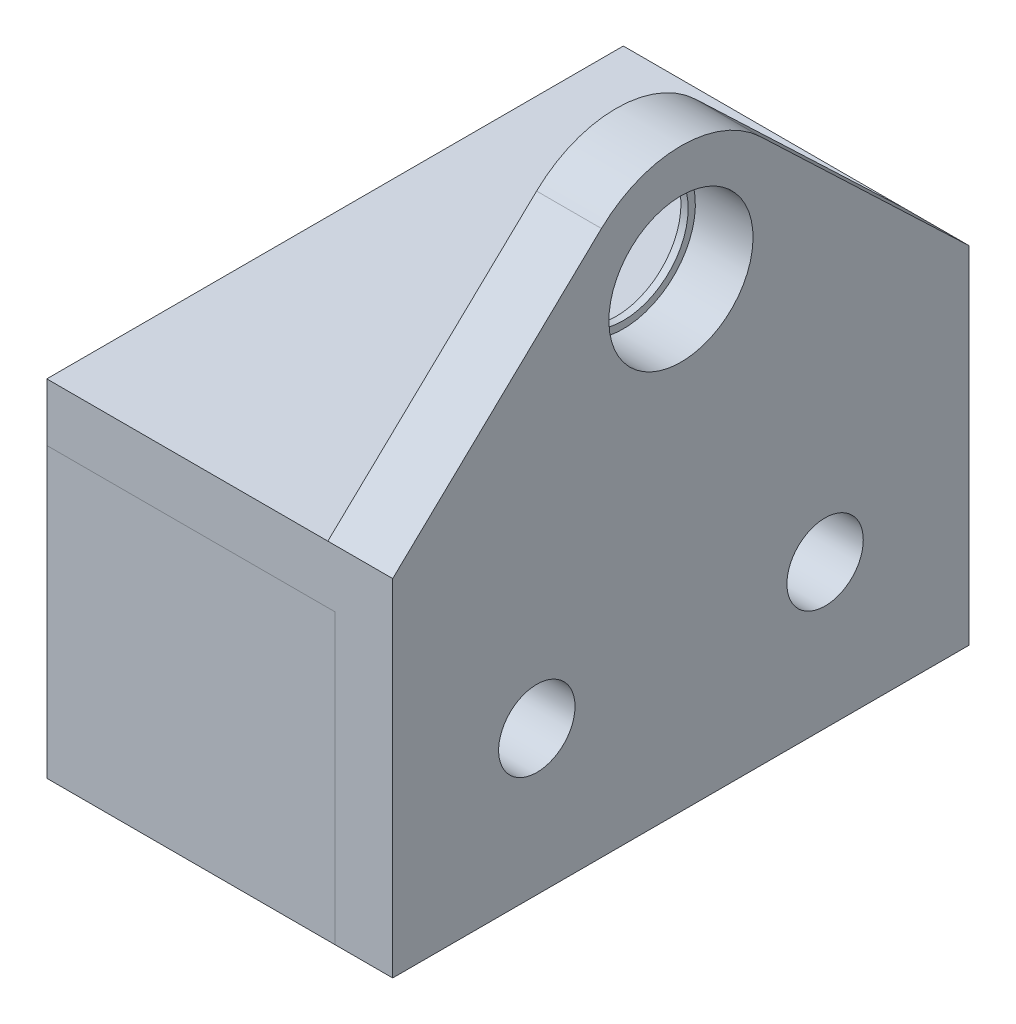
ISO-10303-21;
HEADER;
FILE_DESCRIPTION(('STEP AP214'),'2;1');
FILE_NAME('part.step','',(''),(''),'','','');
FILE_SCHEMA(('AUTOMOTIVE_DESIGN { 1 0 10303 214 1 1 1 1 }'));
ENDSEC;
DATA;
#1=APPLICATION_CONTEXT('core data for automotive mechanical design processes');
#2=APPLICATION_PROTOCOL_DEFINITION('international standard','automotive_design',2000,#1);
#3=PRODUCT_CONTEXT('',#1,'mechanical');
#4=PRODUCT('Part','Part','',(#3));
#5=PRODUCT_RELATED_PRODUCT_CATEGORY('part','',(#4));
#6=PRODUCT_DEFINITION_FORMATION('','',#4);
#7=PRODUCT_DEFINITION_CONTEXT('part definition',#1,'design');
#8=PRODUCT_DEFINITION('design','',#6,#7);
#9=PRODUCT_DEFINITION_SHAPE('','',#8);
#10=(LENGTH_UNIT() NAMED_UNIT(*) SI_UNIT(.MILLI.,.METRE.));
#11=(NAMED_UNIT(*) PLANE_ANGLE_UNIT() SI_UNIT($,.RADIAN.));
#12=(NAMED_UNIT(*) SI_UNIT($,.STERADIAN.) SOLID_ANGLE_UNIT());
#13=UNCERTAINTY_MEASURE_WITH_UNIT(LENGTH_MEASURE(1.E-05),#10,'distance_accuracy_value','');
#14=(GEOMETRIC_REPRESENTATION_CONTEXT(3) GLOBAL_UNCERTAINTY_ASSIGNED_CONTEXT((#13)) GLOBAL_UNIT_ASSIGNED_CONTEXT((#10,
#11,#12)) REPRESENTATION_CONTEXT('',''));
#15=CARTESIAN_POINT('',(0.,0.,0.));
#16=DIRECTION('',(0.,0.,1.));
#17=DIRECTION('',(1.,0.,0.));
#18=AXIS2_PLACEMENT_3D('',#15,#16,#17);
#19=CARTESIAN_POINT('',(-10.,10.,20.));
#20=DIRECTION('',(0.,1.,0.));
#21=DIRECTION('',(-1.,0.,0.));
#22=AXIS2_PLACEMENT_3D('',#19,#20,#21);
#23=PLANE('',#22);
#24=DIRECTION('',(0.,0.,-1.));
#25=VECTOR('',#24,1.);
#26=CARTESIAN_POINT('',(-3.05,10.,8.));
#27=LINE('',#26,#25);
#28=CARTESIAN_POINT('',(-3.05,10.,16.));
#29=VERTEX_POINT('',#28);
#30=CARTESIAN_POINT('',(-3.05,10.,8.));
#31=VERTEX_POINT('',#30);
#32=EDGE_CURVE('E263',#29,#31,#27,.T.);
#33=ORIENTED_EDGE('',*,*,#32,.F.);
#34=DIRECTION('',(-1.,0.,0.));
#35=VECTOR('',#34,1.);
#36=CARTESIAN_POINT('',(-3.05,10.,16.));
#37=LINE('',#36,#35);
#38=CARTESIAN_POINT('',(3.05,10.,16.));
#39=VERTEX_POINT('',#38);
#40=EDGE_CURVE('E268',#39,#29,#37,.T.);
#41=ORIENTED_EDGE('',*,*,#40,.F.);
#42=DIRECTION('',(0.,0.,1.));
#43=VECTOR('',#42,1.);
#44=CARTESIAN_POINT('',(3.05,10.,8.));
#45=LINE('',#44,#43);
#46=CARTESIAN_POINT('',(3.05,10.,8.));
#47=VERTEX_POINT('',#46);
#48=EDGE_CURVE('E277',#47,#39,#45,.T.);
#49=ORIENTED_EDGE('',*,*,#48,.F.);
#50=DIRECTION('',(1.,0.,0.));
#51=VECTOR('',#50,1.);
#52=CARTESIAN_POINT('',(-3.05,10.,8.));
#53=LINE('',#52,#51);
#54=EDGE_CURVE('E274',#31,#47,#53,.T.);
#55=ORIENTED_EDGE('',*,*,#54,.F.);
#56=EDGE_LOOP('',(#33,#41,#49,#55));
#57=FACE_BOUND('',#56,.T.);
#58=DIRECTION('',(0.,0.,1.));
#59=VECTOR('',#58,1.);
#60=CARTESIAN_POINT('',(10.,10.,20.));
#61=LINE('',#60,#59);
#62=CARTESIAN_POINT('',(10.,10.,-20.));
#63=VERTEX_POINT('',#62);
#64=CARTESIAN_POINT('',(10.,10.,20.));
#65=VERTEX_POINT('',#64);
#66=EDGE_CURVE('E289',#63,#65,#61,.T.);
#67=ORIENTED_EDGE('',*,*,#66,.T.);
#68=DIRECTION('',(1.,0.,0.));
#69=VECTOR('',#68,1.);
#70=CARTESIAN_POINT('',(-10.,10.,20.));
#71=LINE('',#70,#69);
#72=CARTESIAN_POINT('',(-10.,10.,20.));
#73=VERTEX_POINT('',#72);
#74=EDGE_CURVE('E300',#73,#65,#71,.T.);
#75=ORIENTED_EDGE('',*,*,#74,.F.);
#76=DIRECTION('',(0.,0.,1.));
#77=VECTOR('',#76,1.);
#78=CARTESIAN_POINT('',(-10.,10.,20.));
#79=LINE('',#78,#77);
#80=CARTESIAN_POINT('',(-10.,10.,-20.));
#81=VERTEX_POINT('',#80);
#82=EDGE_CURVE('E298',#81,#73,#79,.T.);
#83=ORIENTED_EDGE('',*,*,#82,.F.);
#84=DIRECTION('',(1.,0.,0.));
#85=VECTOR('',#84,1.);
#86=CARTESIAN_POINT('',(-10.,10.,-20.));
#87=LINE('',#86,#85);
#88=EDGE_CURVE('E305',#81,#63,#87,.T.);
#89=ORIENTED_EDGE('',*,*,#88,.T.);
#90=EDGE_LOOP('',(#67,#75,#83,#89));
#91=FACE_BOUND('',#90,.T.);
#92=DIRECTION('',(-1.,0.,0.));
#93=VECTOR('',#92,1.);
#94=CARTESIAN_POINT('',(-3.05,10.,-8.));
#95=LINE('',#94,#93);
#96=CARTESIAN_POINT('',(3.05,10.,-8.));
#97=VERTEX_POINT('',#96);
#98=CARTESIAN_POINT('',(-3.05,10.,-8.));
#99=VERTEX_POINT('',#98);
#100=EDGE_CURVE('E236',#97,#99,#95,.T.);
#101=ORIENTED_EDGE('',*,*,#100,.F.);
#102=DIRECTION('',(0.,0.,1.));
#103=VECTOR('',#102,1.);
#104=CARTESIAN_POINT('',(3.05,10.,-8.));
#105=LINE('',#104,#103);
#106=CARTESIAN_POINT('',(3.05,10.,-16.));
#107=VERTEX_POINT('',#106);
#108=EDGE_CURVE('E242',#107,#97,#105,.T.);
#109=ORIENTED_EDGE('',*,*,#108,.F.);
#110=DIRECTION('',(1.,0.,0.));
#111=VECTOR('',#110,1.);
#112=CARTESIAN_POINT('',(-3.05,10.,-16.));
#113=LINE('',#112,#111);
#114=CARTESIAN_POINT('',(-3.05,10.,-16.));
#115=VERTEX_POINT('',#114);
#116=EDGE_CURVE('E251',#115,#107,#113,.T.);
#117=ORIENTED_EDGE('',*,*,#116,.F.);
#118=DIRECTION('',(0.,0.,-1.));
#119=VECTOR('',#118,1.);
#120=CARTESIAN_POINT('',(-3.05,10.,-8.));
#121=LINE('',#120,#119);
#122=EDGE_CURVE('E248',#99,#115,#121,.T.);
#123=ORIENTED_EDGE('',*,*,#122,.F.);
#124=EDGE_LOOP('',(#101,#109,#117,#123));
#125=FACE_BOUND('',#124,.T.);
#126=ADVANCED_FACE('F52',(#57,#91,#125),#23,.F.);
#127=CARTESIAN_POINT('',(9.99999999999999,0.,0.));
#128=DIRECTION('',(1.,0.,0.));
#129=DIRECTION('',(0.,1.,0.));
#130=AXIS2_PLACEMENT_3D('',#127,#128,#129);
#131=PLANE('',#130);
#132=CARTESIAN_POINT('',(9.99999999999999,0.,-10.));
#133=DIRECTION('',(1.,0.,0.));
#134=DIRECTION('',(0.,1.,0.));
#135=AXIS2_PLACEMENT_3D('',#132,#133,#134);
#136=CIRCLE('',#135,2.65);
#137=CARTESIAN_POINT('',(9.99999999999999,2.65,-10.));
#138=VERTEX_POINT('',#137);
#139=EDGE_CURVE('E317',#138,#138,#136,.T.);
#140=ORIENTED_EDGE('',*,*,#139,.T.);
#141=EDGE_LOOP('',(#140));
#142=FACE_BOUND('',#141,.T.);
#143=CARTESIAN_POINT('',(9.99999999999999,0.,10.));
#144=DIRECTION('',(1.,0.,0.));
#145=DIRECTION('',(0.,1.,0.));
#146=AXIS2_PLACEMENT_3D('',#143,#144,#145);
#147=CIRCLE('',#146,2.65);
#148=CARTESIAN_POINT('',(9.99999999999999,2.65,10.));
#149=VERTEX_POINT('',#148);
#150=EDGE_CURVE('E311',#149,#149,#147,.T.);
#151=ORIENTED_EDGE('',*,*,#150,.T.);
#152=EDGE_LOOP('',(#151));
#153=FACE_BOUND('',#152,.T.);
#154=ORIENTED_EDGE('',*,*,#66,.F.);
#155=DIRECTION('',(0.,1.,0.));
#156=VECTOR('',#155,1.);
#157=CARTESIAN_POINT('',(9.99999999999999,0.,-20.));
#158=LINE('',#157,#156);
#159=CARTESIAN_POINT('',(9.99999999999999,-10.,-20.));
#160=VERTEX_POINT('',#159);
#161=EDGE_CURVE('E324',#160,#63,#158,.T.);
#162=ORIENTED_EDGE('',*,*,#161,.F.);
#163=DIRECTION('',(0.,0.,-1.));
#164=VECTOR('',#163,1.);
#165=CARTESIAN_POINT('',(9.99999999999999,-10.,0.));
#166=LINE('',#165,#164);
#167=CARTESIAN_POINT('',(9.99999999999999,-10.,20.));
#168=VERTEX_POINT('',#167);
#169=EDGE_CURVE('E330',#168,#160,#166,.T.);
#170=ORIENTED_EDGE('',*,*,#169,.F.);
#171=DIRECTION('',(0.,1.,0.));
#172=VECTOR('',#171,1.);
#173=CARTESIAN_POINT('',(9.99999999999999,0.,20.));
#174=LINE('',#173,#172);
#175=EDGE_CURVE('E320',#168,#65,#174,.T.);
#176=ORIENTED_EDGE('',*,*,#175,.T.);
#177=EDGE_LOOP('',(#154,#162,#170,#176));
#178=FACE_BOUND('',#177,.T.);
#179=ADVANCED_FACE('F411',(#142,#153,#178),#131,.F.);
#180=CARTESIAN_POINT('',(14.,0.,20.));
#181=DIRECTION('',(0.,0.,1.));
#182=DIRECTION('',(1.,0.,0.));
#183=AXIS2_PLACEMENT_3D('',#180,#181,#182);
#184=PLANE('',#183);
#185=ORIENTED_EDGE('',*,*,#175,.F.);
#186=DIRECTION('',(-1.,0.,0.));
#187=VECTOR('',#186,1.);
#188=CARTESIAN_POINT('',(14.,-10.,20.));
#189=LINE('',#188,#187);
#190=CARTESIAN_POINT('',(14.,-10.,20.));
#191=VERTEX_POINT('',#190);
#192=EDGE_CURVE('E343',#191,#168,#189,.T.);
#193=ORIENTED_EDGE('',*,*,#192,.F.);
#194=DIRECTION('',(0.,1.,0.));
#195=VECTOR('',#194,1.);
#196=CARTESIAN_POINT('',(14.,0.,20.));
#197=LINE('',#196,#195);
#198=CARTESIAN_POINT('',(14.,14.,20.));
#199=VERTEX_POINT('',#198);
#200=EDGE_CURVE('E321',#191,#199,#197,.T.);
#201=ORIENTED_EDGE('',*,*,#200,.T.);
#202=DIRECTION('',(-1.,0.,0.));
#203=VECTOR('',#202,1.);
#204=CARTESIAN_POINT('',(14.,14.,20.));
#205=LINE('',#204,#203);
#206=CARTESIAN_POINT('',(9.5,14.,20.));
#207=VERTEX_POINT('',#206);
#208=EDGE_CURVE('E334',#199,#207,#205,.T.);
#209=ORIENTED_EDGE('',*,*,#208,.T.);
#210=CARTESIAN_POINT('',(-10.,14.,20.));
#211=VERTEX_POINT('',#210);
#212=EDGE_CURVE('E328',#207,#211,#205,.T.);
#213=ORIENTED_EDGE('',*,*,#212,.T.);
#214=DIRECTION('',(0.,1.,0.));
#215=VECTOR('',#214,1.);
#216=CARTESIAN_POINT('',(-10.,14.,20.));
#217=LINE('',#216,#215);
#218=EDGE_CURVE('E290',#73,#211,#217,.T.);
#219=ORIENTED_EDGE('',*,*,#218,.F.);
#220=ORIENTED_EDGE('',*,*,#74,.T.);
#221=EDGE_LOOP('',(#185,#193,#201,#209,#213,#219,#220));
#222=FACE_BOUND('',#221,.T.);
#223=ADVANCED_FACE('F417',(#222),#184,.T.);
#224=CARTESIAN_POINT('',(14.,-10.,0.));
#225=DIRECTION('',(0.,1.,0.));
#226=DIRECTION('',(-1.,0.,0.));
#227=AXIS2_PLACEMENT_3D('',#224,#225,#226);
#228=PLANE('',#227);
#229=ORIENTED_EDGE('',*,*,#169,.T.);
#230=DIRECTION('',(-1.,0.,0.));
#231=VECTOR('',#230,1.);
#232=CARTESIAN_POINT('',(14.,-10.,-20.));
#233=LINE('',#232,#231);
#234=CARTESIAN_POINT('',(14.,-10.,-20.));
#235=VERTEX_POINT('',#234);
#236=EDGE_CURVE('E340',#235,#160,#233,.T.);
#237=ORIENTED_EDGE('',*,*,#236,.F.);
#238=DIRECTION('',(0.,0.,-1.));
#239=VECTOR('',#238,1.);
#240=CARTESIAN_POINT('',(14.,-10.,0.));
#241=LINE('',#240,#239);
#242=EDGE_CURVE('E323',#191,#235,#241,.T.);
#243=ORIENTED_EDGE('',*,*,#242,.F.);
#244=ORIENTED_EDGE('',*,*,#192,.T.);
#245=EDGE_LOOP('',(#229,#237,#243,#244));
#246=FACE_BOUND('',#245,.T.);
#247=ADVANCED_FACE('F444',(#246),#228,.F.);
#248=CARTESIAN_POINT('',(14.,0.,-20.));
#249=DIRECTION('',(0.,0.,1.));
#250=DIRECTION('',(1.,0.,0.));
#251=AXIS2_PLACEMENT_3D('',#248,#249,#250);
#252=PLANE('',#251);
#253=ORIENTED_EDGE('',*,*,#161,.T.);
#254=ORIENTED_EDGE('',*,*,#88,.F.);
#255=DIRECTION('',(0.,-1.,0.));
#256=VECTOR('',#255,1.);
#257=CARTESIAN_POINT('',(-10.,14.,-20.));
#258=LINE('',#257,#256);
#259=CARTESIAN_POINT('',(-10.,14.,-20.));
#260=VERTEX_POINT('',#259);
#261=EDGE_CURVE('E296',#260,#81,#258,.T.);
#262=ORIENTED_EDGE('',*,*,#261,.F.);
#263=DIRECTION('',(-1.,0.,0.));
#264=VECTOR('',#263,1.);
#265=CARTESIAN_POINT('',(14.,14.,-20.));
#266=LINE('',#265,#264);
#267=CARTESIAN_POINT('',(9.5,14.,-20.));
#268=VERTEX_POINT('',#267);
#269=EDGE_CURVE('E336',#268,#260,#266,.T.);
#270=ORIENTED_EDGE('',*,*,#269,.F.);
#271=CARTESIAN_POINT('',(14.,14.,-20.));
#272=VERTEX_POINT('',#271);
#273=EDGE_CURVE('E337',#272,#268,#266,.T.);
#274=ORIENTED_EDGE('',*,*,#273,.F.);
#275=DIRECTION('',(0.,1.,0.));
#276=VECTOR('',#275,1.);
#277=CARTESIAN_POINT('',(14.,0.,-20.));
#278=LINE('',#277,#276);
#279=EDGE_CURVE('E326',#235,#272,#278,.T.);
#280=ORIENTED_EDGE('',*,*,#279,.F.);
#281=ORIENTED_EDGE('',*,*,#236,.T.);
#282=EDGE_LOOP('',(#253,#254,#262,#270,#274,#280,#281));
#283=FACE_BOUND('',#282,.T.);
#284=ADVANCED_FACE('F441',(#283),#252,.F.);
#285=CARTESIAN_POINT('',(14.,14.,0.));
#286=DIRECTION('',(0.,1.,0.));
#287=DIRECTION('',(-1.,0.,0.));
#288=AXIS2_PLACEMENT_3D('',#285,#286,#287);
#289=PLANE('',#288);
#290=DIRECTION('',(0.,0.,1.));
#291=VECTOR('',#290,1.);
#292=CARTESIAN_POINT('',(9.5,14.,0.));
#293=LINE('',#292,#291);
#294=EDGE_CURVE('E67',#268,#207,#293,.T.);
#295=ORIENTED_EDGE('',*,*,#294,.F.);
#296=ORIENTED_EDGE('',*,*,#269,.T.);
#297=DIRECTION('',(0.,0.,-1.));
#298=VECTOR('',#297,1.);
#299=CARTESIAN_POINT('',(-10.,14.,20.));
#300=LINE('',#299,#298);
#301=EDGE_CURVE('E293',#211,#260,#300,.T.);
#302=ORIENTED_EDGE('',*,*,#301,.F.);
#303=ORIENTED_EDGE('',*,*,#212,.F.);
#304=EDGE_LOOP('',(#295,#296,#302,#303));
#305=FACE_BOUND('',#304,.T.);
#306=ADVANCED_FACE('F436',(#305),#289,.T.);
#307=CARTESIAN_POINT('',(14.,0.,0.));
#308=DIRECTION('',(1.,0.,0.));
#309=DIRECTION('',(0.,1.,0.));
#310=AXIS2_PLACEMENT_3D('',#307,#308,#309);
#311=PLANE('',#310);
#312=CARTESIAN_POINT('',(14.,0.,10.));
#313=DIRECTION('',(1.,0.,0.));
#314=DIRECTION('',(0.,0.,-1.));
#315=AXIS2_PLACEMENT_3D('',#312,#313,#314);
#316=CIRCLE('',#315,2.65);
#317=CARTESIAN_POINT('',(14.,0.,7.35));
#318=VERTEX_POINT('',#317);
#319=EDGE_CURVE('E308',#318,#318,#316,.T.);
#320=ORIENTED_EDGE('',*,*,#319,.F.);
#321=EDGE_LOOP('',(#320));
#322=FACE_BOUND('',#321,.T.);
#323=CARTESIAN_POINT('',(14.,0.,-10.));
#324=DIRECTION('',(1.,0.,0.));
#325=DIRECTION('',(0.,0.,-1.));
#326=AXIS2_PLACEMENT_3D('',#323,#324,#325);
#327=CIRCLE('',#326,2.65);
#328=CARTESIAN_POINT('',(14.,0.,-12.65));
#329=VERTEX_POINT('',#328);
#330=EDGE_CURVE('E314',#329,#329,#327,.T.);
#331=ORIENTED_EDGE('',*,*,#330,.F.);
#332=EDGE_LOOP('',(#331));
#333=FACE_BOUND('',#332,.T.);
#334=ORIENTED_EDGE('',*,*,#200,.F.);
#335=ORIENTED_EDGE('',*,*,#242,.T.);
#336=ORIENTED_EDGE('',*,*,#279,.T.);
#337=DIRECTION('',(0.,-0.689655172413793,-0.724137931034483));
#338=VECTOR('',#337,1.);
#339=CARTESIAN_POINT('',(14.,17.3293697978597,-16.5041617122473));
#340=LINE('',#339,#338);
#341=CARTESIAN_POINT('',(14.,27.7931034482759,-5.51724137931034));
#342=VERTEX_POINT('',#341);
#343=EDGE_CURVE('E222',#342,#272,#340,.T.);
#344=ORIENTED_EDGE('',*,*,#343,.F.);
#345=CARTESIAN_POINT('',(14.,22.,0.));
#346=DIRECTION('',(1.,0.,0.));
#347=DIRECTION('',(0.,1.,0.));
#348=AXIS2_PLACEMENT_3D('',#345,#346,#347);
#349=CIRCLE('',#348,8.);
#350=CARTESIAN_POINT('',(14.,27.7931034482759,5.51724137931034));
#351=VERTEX_POINT('',#350);
#352=EDGE_CURVE('E230',#351,#342,#349,.F.);
#353=ORIENTED_EDGE('',*,*,#352,.F.);
#354=DIRECTION('',(0.,0.689655172413793,-0.724137931034483));
#355=VECTOR('',#354,1.);
#356=CARTESIAN_POINT('',(14.,17.3293697978597,16.5041617122473));
#357=LINE('',#356,#355);
#358=EDGE_CURVE('E210',#199,#351,#357,.T.);
#359=ORIENTED_EDGE('',*,*,#358,.F.);
#360=EDGE_LOOP('',(#334,#335,#336,#344,#353,#359));
#361=FACE_BOUND('',#360,.T.);
#362=CARTESIAN_POINT('',(14.,22.,0.));
#363=DIRECTION('',(1.,0.,0.));
#364=DIRECTION('',(0.,1.,0.));
#365=AXIS2_PLACEMENT_3D('',#362,#363,#364);
#366=CIRCLE('',#365,5.);
#367=CARTESIAN_POINT('',(14.,27.,0.));
#368=VERTEX_POINT('',#367);
#369=EDGE_CURVE('E219',#368,#368,#366,.T.);
#370=ORIENTED_EDGE('',*,*,#369,.F.);
#371=EDGE_LOOP('',(#370));
#372=FACE_BOUND('',#371,.T.);
#373=ADVANCED_FACE('F433',(#322,#333,#361,#372),#311,.T.);
#374=CARTESIAN_POINT('',(14.,0.,-10.));
#375=DIRECTION('',(1.,0.,0.));
#376=DIRECTION('',(0.,0.,-1.));
#377=AXIS2_PLACEMENT_3D('',#374,#375,#376);
#378=CYLINDRICAL_SURFACE('',#377,2.65);
#379=ORIENTED_EDGE('',*,*,#139,.F.);
#380=EDGE_LOOP('',(#379));
#381=FACE_BOUND('',#380,.T.);
#382=ORIENTED_EDGE('',*,*,#330,.T.);
#383=EDGE_LOOP('',(#382));
#384=FACE_BOUND('',#383,.T.);
#385=ADVANCED_FACE('F429',(#381,#384),#378,.F.);
#386=CARTESIAN_POINT('',(14.,0.,10.));
#387=DIRECTION('',(1.,0.,0.));
#388=DIRECTION('',(0.,0.,-1.));
#389=AXIS2_PLACEMENT_3D('',#386,#387,#388);
#390=CYLINDRICAL_SURFACE('',#389,2.65);
#391=ORIENTED_EDGE('',*,*,#150,.F.);
#392=EDGE_LOOP('',(#391));
#393=FACE_BOUND('',#392,.T.);
#394=ORIENTED_EDGE('',*,*,#319,.T.);
#395=EDGE_LOOP('',(#394));
#396=FACE_BOUND('',#395,.T.);
#397=ADVANCED_FACE('F426',(#393,#396),#390,.F.);
#398=CARTESIAN_POINT('',(-10.,0.,0.));
#399=DIRECTION('',(1.,0.,0.));
#400=DIRECTION('',(0.,0.,-1.));
#401=AXIS2_PLACEMENT_3D('',#398,#399,#400);
#402=PLANE('',#401);
#403=ORIENTED_EDGE('',*,*,#218,.T.);
#404=ORIENTED_EDGE('',*,*,#301,.T.);
#405=ORIENTED_EDGE('',*,*,#261,.T.);
#406=ORIENTED_EDGE('',*,*,#82,.T.);
#407=EDGE_LOOP('',(#403,#404,#405,#406));
#408=FACE_BOUND('',#407,.T.);
#409=ADVANCED_FACE('F424',(#408),#402,.F.);
#410=CARTESIAN_POINT('',(-3.05,7.,8.));
#411=DIRECTION('',(1.,0.,0.));
#412=DIRECTION('',(0.,1.,0.));
#413=AXIS2_PLACEMENT_3D('',#410,#411,#412);
#414=PLANE('',#413);
#415=DIRECTION('',(0.,1.,0.));
#416=VECTOR('',#415,1.);
#417=CARTESIAN_POINT('',(-3.05,7.,8.));
#418=LINE('',#417,#416);
#419=CARTESIAN_POINT('',(-3.05,8.,8.));
#420=VERTEX_POINT('',#419);
#421=EDGE_CURVE('E287',#420,#31,#418,.T.);
#422=ORIENTED_EDGE('',*,*,#421,.F.);
#423=DIRECTION('',(0.,0.,1.));
#424=VECTOR('',#423,1.);
#425=CARTESIAN_POINT('',(-3.05,8.,8.));
#426=LINE('',#425,#424);
#427=CARTESIAN_POINT('',(-3.05,8.,16.));
#428=VERTEX_POINT('',#427);
#429=EDGE_CURVE('E355',#420,#428,#426,.T.);
#430=ORIENTED_EDGE('',*,*,#429,.T.);
#431=DIRECTION('',(0.,1.,0.));
#432=VECTOR('',#431,1.);
#433=CARTESIAN_POINT('',(-3.05,7.,16.));
#434=LINE('',#433,#432);
#435=EDGE_CURVE('E271',#428,#29,#434,.T.);
#436=ORIENTED_EDGE('',*,*,#435,.T.);
#437=ORIENTED_EDGE('',*,*,#32,.T.);
#438=EDGE_LOOP('',(#422,#430,#436,#437));
#439=FACE_BOUND('',#438,.T.);
#440=ADVANCED_FACE('F476',(#439),#414,.F.);
#441=CARTESIAN_POINT('',(-3.05,7.,8.));
#442=DIRECTION('',(0.,0.,1.));
#443=DIRECTION('',(1.,0.,0.));
#444=AXIS2_PLACEMENT_3D('',#441,#442,#443);
#445=PLANE('',#444);
#446=DIRECTION('',(1.,0.,0.));
#447=VECTOR('',#446,1.);
#448=CARTESIAN_POINT('',(-3.05,7.,8.));
#449=LINE('',#448,#447);
#450=CARTESIAN_POINT('',(-2.05000000000001,7.,8.));
#451=VERTEX_POINT('',#450);
#452=CARTESIAN_POINT('',(2.05000000000001,7.,8.));
#453=VERTEX_POINT('',#452);
#454=EDGE_CURVE('E264',#451,#453,#449,.T.);
#455=ORIENTED_EDGE('',*,*,#454,.F.);
#456=DIRECTION('',(0.707106781186545,-0.70710678118655,0.));
#457=VECTOR('',#456,1.);
#458=CARTESIAN_POINT('',(-2.05000000000001,7.,8.));
#459=LINE('',#458,#457);
#460=EDGE_CURVE('E353',#451,#420,#459,.F.);
#461=ORIENTED_EDGE('',*,*,#460,.T.);
#462=ORIENTED_EDGE('',*,*,#421,.T.);
#463=ORIENTED_EDGE('',*,*,#54,.T.);
#464=DIRECTION('',(0.,1.,0.));
#465=VECTOR('',#464,1.);
#466=CARTESIAN_POINT('',(3.05,7.,8.));
#467=LINE('',#466,#465);
#468=CARTESIAN_POINT('',(3.05,8.,8.));
#469=VERTEX_POINT('',#468);
#470=EDGE_CURVE('E285',#469,#47,#467,.T.);
#471=ORIENTED_EDGE('',*,*,#470,.F.);
#472=DIRECTION('',(0.707106781186545,0.70710678118655,0.));
#473=VECTOR('',#472,1.);
#474=CARTESIAN_POINT('',(2.05000000000001,7.,8.));
#475=LINE('',#474,#473);
#476=EDGE_CURVE('E351',#469,#453,#475,.F.);
#477=ORIENTED_EDGE('',*,*,#476,.T.);
#478=EDGE_LOOP('',(#455,#461,#462,#463,#471,#477));
#479=FACE_BOUND('',#478,.T.);
#480=ADVANCED_FACE('F466',(#479),#445,.F.);
#481=CARTESIAN_POINT('',(3.05,7.,8.));
#482=DIRECTION('',(-1.,0.,0.));
#483=DIRECTION('',(0.,-1.,0.));
#484=AXIS2_PLACEMENT_3D('',#481,#482,#483);
#485=PLANE('',#484);
#486=DIRECTION('',(0.,1.,0.));
#487=VECTOR('',#486,1.);
#488=CARTESIAN_POINT('',(3.05,7.,16.));
#489=LINE('',#488,#487);
#490=CARTESIAN_POINT('',(3.05,8.,16.));
#491=VERTEX_POINT('',#490);
#492=EDGE_CURVE('E283',#491,#39,#489,.T.);
#493=ORIENTED_EDGE('',*,*,#492,.F.);
#494=DIRECTION('',(0.,0.,-1.));
#495=VECTOR('',#494,1.);
#496=CARTESIAN_POINT('',(3.05,8.,8.));
#497=LINE('',#496,#495);
#498=EDGE_CURVE('E361',#491,#469,#497,.T.);
#499=ORIENTED_EDGE('',*,*,#498,.T.);
#500=ORIENTED_EDGE('',*,*,#470,.T.);
#501=ORIENTED_EDGE('',*,*,#48,.T.);
#502=EDGE_LOOP('',(#493,#499,#500,#501));
#503=FACE_BOUND('',#502,.T.);
#504=ADVANCED_FACE('F484',(#503),#485,.F.);
#505=CARTESIAN_POINT('',(-3.05,7.,16.));
#506=DIRECTION('',(0.,0.,-1.));
#507=DIRECTION('',(-1.,0.,0.));
#508=AXIS2_PLACEMENT_3D('',#505,#506,#507);
#509=PLANE('',#508);
#510=ORIENTED_EDGE('',*,*,#435,.F.);
#511=DIRECTION('',(-0.707106781186545,0.70710678118655,0.));
#512=VECTOR('',#511,1.);
#513=CARTESIAN_POINT('',(-2.05000000000001,7.,16.));
#514=LINE('',#513,#512);
#515=CARTESIAN_POINT('',(-2.05000000000001,7.,16.));
#516=VERTEX_POINT('',#515);
#517=EDGE_CURVE('E359',#428,#516,#514,.F.);
#518=ORIENTED_EDGE('',*,*,#517,.T.);
#519=DIRECTION('',(-1.,0.,0.));
#520=VECTOR('',#519,1.);
#521=CARTESIAN_POINT('',(-3.05,7.,16.));
#522=LINE('',#521,#520);
#523=CARTESIAN_POINT('',(2.05000000000001,7.,16.));
#524=VERTEX_POINT('',#523);
#525=EDGE_CURVE('E267',#524,#516,#522,.T.);
#526=ORIENTED_EDGE('',*,*,#525,.F.);
#527=DIRECTION('',(-0.707106781186545,-0.70710678118655,0.));
#528=VECTOR('',#527,1.);
#529=CARTESIAN_POINT('',(2.05000000000001,7.,16.));
#530=LINE('',#529,#528);
#531=EDGE_CURVE('E357',#524,#491,#530,.F.);
#532=ORIENTED_EDGE('',*,*,#531,.T.);
#533=ORIENTED_EDGE('',*,*,#492,.T.);
#534=ORIENTED_EDGE('',*,*,#40,.T.);
#535=EDGE_LOOP('',(#510,#518,#526,#532,#533,#534));
#536=FACE_BOUND('',#535,.T.);
#537=ADVANCED_FACE('F481',(#536),#509,.F.);
#538=CARTESIAN_POINT('',(0.,7.,0.));
#539=DIRECTION('',(0.,1.,0.));
#540=DIRECTION('',(0.,0.,1.));
#541=AXIS2_PLACEMENT_3D('',#538,#539,#540);
#542=PLANE('',#541);
#543=ORIENTED_EDGE('',*,*,#525,.T.);
#544=DIRECTION('',(0.,0.,-1.));
#545=VECTOR('',#544,1.);
#546=CARTESIAN_POINT('',(-2.05000000000001,7.,0.));
#547=LINE('',#546,#545);
#548=EDGE_CURVE('E348',#516,#451,#547,.T.);
#549=ORIENTED_EDGE('',*,*,#548,.T.);
#550=ORIENTED_EDGE('',*,*,#454,.T.);
#551=DIRECTION('',(0.,0.,1.));
#552=VECTOR('',#551,1.);
#553=CARTESIAN_POINT('',(2.05000000000001,7.,0.));
#554=LINE('',#553,#552);
#555=EDGE_CURVE('E345',#453,#524,#554,.T.);
#556=ORIENTED_EDGE('',*,*,#555,.T.);
#557=EDGE_LOOP('',(#543,#549,#550,#556));
#558=FACE_BOUND('',#557,.T.);
#559=ADVANCED_FACE('F468',(#558),#542,.F.);
#560=CARTESIAN_POINT('',(-3.05,7.,-8.));
#561=DIRECTION('',(0.,0.,-1.));
#562=DIRECTION('',(-1.,0.,0.));
#563=AXIS2_PLACEMENT_3D('',#560,#561,#562);
#564=PLANE('',#563);
#565=DIRECTION('',(-1.,0.,0.));
#566=VECTOR('',#565,1.);
#567=CARTESIAN_POINT('',(-3.05,7.,-8.));
#568=LINE('',#567,#566);
#569=CARTESIAN_POINT('',(2.05000000000001,7.,-8.));
#570=VERTEX_POINT('',#569);
#571=CARTESIAN_POINT('',(-2.05000000000001,7.,-8.));
#572=VERTEX_POINT('',#571);
#573=EDGE_CURVE('E238',#570,#572,#568,.T.);
#574=ORIENTED_EDGE('',*,*,#573,.F.);
#575=DIRECTION('',(-0.707106781186545,-0.70710678118655,0.));
#576=VECTOR('',#575,1.);
#577=CARTESIAN_POINT('',(2.05000000000001,7.,-8.));
#578=LINE('',#577,#576);
#579=CARTESIAN_POINT('',(3.05,8.,-8.));
#580=VERTEX_POINT('',#579);
#581=EDGE_CURVE('E371',#570,#580,#578,.F.);
#582=ORIENTED_EDGE('',*,*,#581,.T.);
#583=DIRECTION('',(0.,1.,0.));
#584=VECTOR('',#583,1.);
#585=CARTESIAN_POINT('',(3.05,7.,-8.));
#586=LINE('',#585,#584);
#587=EDGE_CURVE('E245',#580,#97,#586,.T.);
#588=ORIENTED_EDGE('',*,*,#587,.T.);
#589=ORIENTED_EDGE('',*,*,#100,.T.);
#590=DIRECTION('',(0.,1.,0.));
#591=VECTOR('',#590,1.);
#592=CARTESIAN_POINT('',(-3.05,7.,-8.));
#593=LINE('',#592,#591);
#594=CARTESIAN_POINT('',(-3.05,8.,-8.));
#595=VERTEX_POINT('',#594);
#596=EDGE_CURVE('E261',#595,#99,#593,.T.);
#597=ORIENTED_EDGE('',*,*,#596,.F.);
#598=DIRECTION('',(-0.707106781186545,0.70710678118655,0.));
#599=VECTOR('',#598,1.);
#600=CARTESIAN_POINT('',(-2.05000000000001,7.,-8.));
#601=LINE('',#600,#599);
#602=EDGE_CURVE('E369',#595,#572,#601,.F.);
#603=ORIENTED_EDGE('',*,*,#602,.T.);
#604=EDGE_LOOP('',(#574,#582,#588,#589,#597,#603));
#605=FACE_BOUND('',#604,.T.);
#606=ADVANCED_FACE('F388',(#605),#564,.F.);
#607=CARTESIAN_POINT('',(-3.05,7.,-8.));
#608=DIRECTION('',(1.,0.,0.));
#609=DIRECTION('',(0.,1.,0.));
#610=AXIS2_PLACEMENT_3D('',#607,#608,#609);
#611=PLANE('',#610);
#612=DIRECTION('',(0.,1.,0.));
#613=VECTOR('',#612,1.);
#614=CARTESIAN_POINT('',(-3.05,7.,-16.));
#615=LINE('',#614,#613);
#616=CARTESIAN_POINT('',(-3.05,8.,-16.));
#617=VERTEX_POINT('',#616);
#618=EDGE_CURVE('E259',#617,#115,#615,.T.);
#619=ORIENTED_EDGE('',*,*,#618,.F.);
#620=DIRECTION('',(0.,0.,1.));
#621=VECTOR('',#620,1.);
#622=CARTESIAN_POINT('',(-3.05,8.,-8.));
#623=LINE('',#622,#621);
#624=EDGE_CURVE('E13',#617,#595,#623,.T.);
#625=ORIENTED_EDGE('',*,*,#624,.T.);
#626=ORIENTED_EDGE('',*,*,#596,.T.);
#627=ORIENTED_EDGE('',*,*,#122,.T.);
#628=EDGE_LOOP('',(#619,#625,#626,#627));
#629=FACE_BOUND('',#628,.T.);
#630=ADVANCED_FACE('F398',(#629),#611,.F.);
#631=CARTESIAN_POINT('',(-3.05,7.,-16.));
#632=DIRECTION('',(0.,0.,1.));
#633=DIRECTION('',(1.,0.,0.));
#634=AXIS2_PLACEMENT_3D('',#631,#632,#633);
#635=PLANE('',#634);
#636=DIRECTION('',(0.,1.,0.));
#637=VECTOR('',#636,1.);
#638=CARTESIAN_POINT('',(3.05,7.,-16.));
#639=LINE('',#638,#637);
#640=CARTESIAN_POINT('',(3.05,8.,-16.));
#641=VERTEX_POINT('',#640);
#642=EDGE_CURVE('E257',#641,#107,#639,.T.);
#643=ORIENTED_EDGE('',*,*,#642,.F.);
#644=DIRECTION('',(0.707106781186545,0.70710678118655,0.));
#645=VECTOR('',#644,1.);
#646=CARTESIAN_POINT('',(2.05000000000001,7.,-16.));
#647=LINE('',#646,#645);
#648=CARTESIAN_POINT('',(2.05000000000001,7.,-16.));
#649=VERTEX_POINT('',#648);
#650=EDGE_CURVE('E60',#641,#649,#647,.F.);
#651=ORIENTED_EDGE('',*,*,#650,.T.);
#652=DIRECTION('',(1.,0.,0.));
#653=VECTOR('',#652,1.);
#654=CARTESIAN_POINT('',(-3.05,7.,-16.));
#655=LINE('',#654,#653);
#656=CARTESIAN_POINT('',(-2.05000000000001,7.,-16.));
#657=VERTEX_POINT('',#656);
#658=EDGE_CURVE('E241',#657,#649,#655,.T.);
#659=ORIENTED_EDGE('',*,*,#658,.F.);
#660=DIRECTION('',(0.707106781186545,-0.70710678118655,0.));
#661=VECTOR('',#660,1.);
#662=CARTESIAN_POINT('',(-2.05000000000001,7.,-16.));
#663=LINE('',#662,#661);
#664=EDGE_CURVE('E75',#657,#617,#663,.F.);
#665=ORIENTED_EDGE('',*,*,#664,.T.);
#666=ORIENTED_EDGE('',*,*,#618,.T.);
#667=ORIENTED_EDGE('',*,*,#116,.T.);
#668=EDGE_LOOP('',(#643,#651,#659,#665,#666,#667));
#669=FACE_BOUND('',#668,.T.);
#670=ADVANCED_FACE('F377',(#669),#635,.F.);
#671=CARTESIAN_POINT('',(3.05,7.,-8.));
#672=DIRECTION('',(-1.,0.,0.));
#673=DIRECTION('',(0.,-1.,0.));
#674=AXIS2_PLACEMENT_3D('',#671,#672,#673);
#675=PLANE('',#674);
#676=ORIENTED_EDGE('',*,*,#587,.F.);
#677=DIRECTION('',(0.,0.,-1.));
#678=VECTOR('',#677,1.);
#679=CARTESIAN_POINT('',(3.05,8.,-8.));
#680=LINE('',#679,#678);
#681=EDGE_CURVE('E373',#580,#641,#680,.T.);
#682=ORIENTED_EDGE('',*,*,#681,.T.);
#683=ORIENTED_EDGE('',*,*,#642,.T.);
#684=ORIENTED_EDGE('',*,*,#108,.T.);
#685=EDGE_LOOP('',(#676,#682,#683,#684));
#686=FACE_BOUND('',#685,.T.);
#687=ADVANCED_FACE('F391',(#686),#675,.F.);
#688=CARTESIAN_POINT('',(0.,7.,0.));
#689=DIRECTION('',(0.,1.,0.));
#690=DIRECTION('',(0.,0.,1.));
#691=AXIS2_PLACEMENT_3D('',#688,#689,#690);
#692=PLANE('',#691);
#693=ORIENTED_EDGE('',*,*,#658,.T.);
#694=DIRECTION('',(0.,0.,1.));
#695=VECTOR('',#694,1.);
#696=CARTESIAN_POINT('',(2.05000000000001,7.,0.));
#697=LINE('',#696,#695);
#698=EDGE_CURVE('E366',#649,#570,#697,.T.);
#699=ORIENTED_EDGE('',*,*,#698,.T.);
#700=ORIENTED_EDGE('',*,*,#573,.T.);
#701=DIRECTION('',(0.,0.,-1.));
#702=VECTOR('',#701,1.);
#703=CARTESIAN_POINT('',(-2.05000000000001,7.,0.));
#704=LINE('',#703,#702);
#705=EDGE_CURVE('E363',#572,#657,#704,.T.);
#706=ORIENTED_EDGE('',*,*,#705,.T.);
#707=EDGE_LOOP('',(#693,#699,#700,#706));
#708=FACE_BOUND('',#707,.T.);
#709=ADVANCED_FACE('F382',(#708),#692,.F.);
#710=CARTESIAN_POINT('',(-2.05000000000001,7.,0.));
#711=DIRECTION('',(0.70710678118655,0.707106781186545,0.));
#712=DIRECTION('',(0.,0.,-1.));
#713=AXIS2_PLACEMENT_3D('',#710,#711,#712);
#714=PLANE('',#713);
#715=ORIENTED_EDGE('',*,*,#517,.F.);
#716=ORIENTED_EDGE('',*,*,#429,.F.);
#717=ORIENTED_EDGE('',*,*,#460,.F.);
#718=ORIENTED_EDGE('',*,*,#548,.F.);
#719=EDGE_LOOP('',(#715,#716,#717,#718));
#720=FACE_BOUND('',#719,.T.);
#721=ADVANCED_FACE('F452',(#720),#714,.F.);
#722=CARTESIAN_POINT('',(2.05000000000001,7.,0.));
#723=DIRECTION('',(-0.70710678118655,0.707106781186545,0.));
#724=DIRECTION('',(0.,0.,1.));
#725=AXIS2_PLACEMENT_3D('',#722,#723,#724);
#726=PLANE('',#725);
#727=ORIENTED_EDGE('',*,*,#476,.F.);
#728=ORIENTED_EDGE('',*,*,#498,.F.);
#729=ORIENTED_EDGE('',*,*,#531,.F.);
#730=ORIENTED_EDGE('',*,*,#555,.F.);
#731=EDGE_LOOP('',(#727,#728,#729,#730));
#732=FACE_BOUND('',#731,.T.);
#733=ADVANCED_FACE('F409',(#732),#726,.F.);
#734=CARTESIAN_POINT('',(2.05000000000001,7.,0.));
#735=DIRECTION('',(-0.70710678118655,0.707106781186545,0.));
#736=DIRECTION('',(0.,0.,1.));
#737=AXIS2_PLACEMENT_3D('',#734,#735,#736);
#738=PLANE('',#737);
#739=ORIENTED_EDGE('',*,*,#650,.F.);
#740=ORIENTED_EDGE('',*,*,#681,.F.);
#741=ORIENTED_EDGE('',*,*,#581,.F.);
#742=ORIENTED_EDGE('',*,*,#698,.F.);
#743=EDGE_LOOP('',(#739,#740,#741,#742));
#744=FACE_BOUND('',#743,.T.);
#745=ADVANCED_FACE('F385',(#744),#738,.F.);
#746=CARTESIAN_POINT('',(-2.05000000000001,7.,0.));
#747=DIRECTION('',(0.70710678118655,0.707106781186545,0.));
#748=DIRECTION('',(0.,0.,-1.));
#749=AXIS2_PLACEMENT_3D('',#746,#747,#748);
#750=PLANE('',#749);
#751=ORIENTED_EDGE('',*,*,#602,.F.);
#752=ORIENTED_EDGE('',*,*,#624,.F.);
#753=ORIENTED_EDGE('',*,*,#664,.F.);
#754=ORIENTED_EDGE('',*,*,#705,.F.);
#755=EDGE_LOOP('',(#751,#752,#753,#754));
#756=FACE_BOUND('',#755,.T.);
#757=ADVANCED_FACE('F54',(#756),#750,.F.);
#758=CARTESIAN_POINT('',(9.5,22.,0.));
#759=DIRECTION('',(1.,0.,0.));
#760=DIRECTION('',(0.,1.,0.));
#761=AXIS2_PLACEMENT_3D('',#758,#759,#760);
#762=CYLINDRICAL_SURFACE('',#761,8.);
#763=ORIENTED_EDGE('',*,*,#352,.T.);
#764=DIRECTION('',(1.,0.,0.));
#765=VECTOR('',#764,1.);
#766=CARTESIAN_POINT('',(9.5,27.7931034482759,-5.51724137931034));
#767=LINE('',#766,#765);
#768=CARTESIAN_POINT('',(9.5,27.7931034482759,-5.51724137931034));
#769=VERTEX_POINT('',#768);
#770=EDGE_CURVE('E214',#769,#342,#767,.T.);
#771=ORIENTED_EDGE('',*,*,#770,.F.);
#772=CARTESIAN_POINT('',(9.5,22.,0.));
#773=DIRECTION('',(1.,0.,0.));
#774=DIRECTION('',(0.,1.,0.));
#775=AXIS2_PLACEMENT_3D('',#772,#773,#774);
#776=CIRCLE('',#775,8.);
#777=CARTESIAN_POINT('',(9.5,27.7931034482759,5.51724137931034));
#778=VERTEX_POINT('',#777);
#779=EDGE_CURVE('E201',#778,#769,#776,.F.);
#780=ORIENTED_EDGE('',*,*,#779,.F.);
#781=DIRECTION('',(1.,0.,0.));
#782=VECTOR('',#781,1.);
#783=CARTESIAN_POINT('',(9.5,27.7931034482759,5.51724137931034));
#784=LINE('',#783,#782);
#785=EDGE_CURVE('E207',#778,#351,#784,.T.);
#786=ORIENTED_EDGE('',*,*,#785,.T.);
#787=EDGE_LOOP('',(#763,#771,#780,#786));
#788=FACE_BOUND('',#787,.T.);
#789=ADVANCED_FACE('F217',(#788),#762,.T.);
#790=CARTESIAN_POINT('',(9.5,17.3293697978597,-16.5041617122473));
#791=DIRECTION('',(0.,-0.724137931034483,0.689655172413793));
#792=DIRECTION('',(0.,-0.689655172413793,-0.724137931034483));
#793=AXIS2_PLACEMENT_3D('',#790,#791,#792);
#794=PLANE('',#793);
#795=ORIENTED_EDGE('',*,*,#343,.T.);
#796=ORIENTED_EDGE('',*,*,#273,.T.);
#797=DIRECTION('',(0.,-0.689655172413793,-0.724137931034483));
#798=VECTOR('',#797,1.);
#799=CARTESIAN_POINT('',(9.5,17.3293697978597,-16.5041617122473));
#800=LINE('',#799,#798);
#801=EDGE_CURVE('E215',#769,#268,#800,.T.);
#802=ORIENTED_EDGE('',*,*,#801,.F.);
#803=ORIENTED_EDGE('',*,*,#770,.T.);
#804=EDGE_LOOP('',(#795,#796,#802,#803));
#805=FACE_BOUND('',#804,.T.);
#806=ADVANCED_FACE('F407',(#805),#794,.F.);
#807=CARTESIAN_POINT('',(9.5,17.3293697978597,16.5041617122473));
#808=DIRECTION('',(0.,-0.724137931034483,-0.689655172413793));
#809=DIRECTION('',(0.,0.689655172413793,-0.724137931034483));
#810=AXIS2_PLACEMENT_3D('',#807,#808,#809);
#811=PLANE('',#810);
#812=ORIENTED_EDGE('',*,*,#358,.T.);
#813=ORIENTED_EDGE('',*,*,#785,.F.);
#814=DIRECTION('',(0.,0.689655172413793,-0.724137931034483));
#815=VECTOR('',#814,1.);
#816=CARTESIAN_POINT('',(9.5,17.3293697978597,16.5041617122473));
#817=LINE('',#816,#815);
#818=EDGE_CURVE('E195',#207,#778,#817,.T.);
#819=ORIENTED_EDGE('',*,*,#818,.F.);
#820=ORIENTED_EDGE('',*,*,#208,.F.);
#821=EDGE_LOOP('',(#812,#813,#819,#820));
#822=FACE_BOUND('',#821,.T.);
#823=ADVANCED_FACE('F208',(#822),#811,.F.);
#824=CARTESIAN_POINT('',(9.5,22.,0.));
#825=DIRECTION('',(1.,0.,0.));
#826=DIRECTION('',(0.,1.,0.));
#827=AXIS2_PLACEMENT_3D('',#824,#825,#826);
#828=CYLINDRICAL_SURFACE('',#827,5.);
#829=CARTESIAN_POINT('',(10.,22.,0.));
#830=DIRECTION('',(1.,0.,0.));
#831=DIRECTION('',(0.,1.,0.));
#832=AXIS2_PLACEMENT_3D('',#829,#830,#831);
#833=CIRCLE('',#832,5.);
#834=CARTESIAN_POINT('',(10.,27.,0.));
#835=VERTEX_POINT('',#834);
#836=EDGE_CURVE('E225',#835,#835,#833,.F.);
#837=ORIENTED_EDGE('',*,*,#836,.T.);
#838=EDGE_LOOP('',(#837));
#839=FACE_BOUND('',#838,.T.);
#840=ORIENTED_EDGE('',*,*,#369,.T.);
#841=EDGE_LOOP('',(#840));
#842=FACE_BOUND('',#841,.T.);
#843=ADVANCED_FACE('F521',(#839,#842),#828,.F.);
#844=CARTESIAN_POINT('',(9.49999999999999,0.,0.));
#845=DIRECTION('',(1.,0.,0.));
#846=DIRECTION('',(0.,1.,0.));
#847=AXIS2_PLACEMENT_3D('',#844,#845,#846);
#848=PLANE('',#847);
#849=ORIENTED_EDGE('',*,*,#779,.T.);
#850=ORIENTED_EDGE('',*,*,#801,.T.);
#851=ORIENTED_EDGE('',*,*,#294,.T.);
#852=ORIENTED_EDGE('',*,*,#818,.T.);
#853=EDGE_LOOP('',(#849,#850,#851,#852));
#854=FACE_BOUND('',#853,.T.);
#855=CARTESIAN_POINT('',(9.5,22.,0.));
#856=DIRECTION('',(-1.,0.,0.));
#857=DIRECTION('',(0.,-1.,0.));
#858=AXIS2_PLACEMENT_3D('',#855,#856,#857);
#859=CIRCLE('',#858,4.5);
#860=CARTESIAN_POINT('',(9.5,17.5,0.));
#861=VERTEX_POINT('',#860);
#862=EDGE_CURVE('E675',#861,#861,#859,.T.);
#863=ORIENTED_EDGE('',*,*,#862,.F.);
#864=EDGE_LOOP('',(#863));
#865=FACE_BOUND('',#864,.T.);
#866=ADVANCED_FACE('F197',(#854,#865),#848,.F.);
#867=CARTESIAN_POINT('',(28.142135623731,22.,0.));
#868=DIRECTION('',(-1.,0.,0.));
#869=DIRECTION('',(0.,-1.,0.));
#870=AXIS2_PLACEMENT_3D('',#867,#868,#869);
#871=CYLINDRICAL_SURFACE('',#870,4.5);
#872=ORIENTED_EDGE('',*,*,#862,.T.);
#873=EDGE_LOOP('',(#872));
#874=FACE_BOUND('',#873,.T.);
#875=CARTESIAN_POINT('',(10.,22.,0.));
#876=DIRECTION('',(1.,0.,0.));
#877=DIRECTION('',(0.,1.,0.));
#878=AXIS2_PLACEMENT_3D('',#875,#876,#877);
#879=CIRCLE('',#878,4.5);
#880=CARTESIAN_POINT('',(10.,26.5,0.));
#881=VERTEX_POINT('',#880);
#882=EDGE_CURVE('E232',#881,#881,#879,.F.);
#883=ORIENTED_EDGE('',*,*,#882,.F.);
#884=EDGE_LOOP('',(#883));
#885=FACE_BOUND('',#884,.T.);
#886=ADVANCED_FACE('F529',(#874,#885),#871,.F.);
#887=CARTESIAN_POINT('',(9.99999999999999,0.,0.));
#888=DIRECTION('',(1.,0.,0.));
#889=DIRECTION('',(0.,1.,0.));
#890=AXIS2_PLACEMENT_3D('',#887,#888,#889);
#891=PLANE('',#890);
#892=ORIENTED_EDGE('',*,*,#836,.F.);
#893=EDGE_LOOP('',(#892));
#894=FACE_BOUND('',#893,.T.);
#895=ORIENTED_EDGE('',*,*,#882,.T.);
#896=EDGE_LOOP('',(#895));
#897=FACE_BOUND('',#896,.T.);
#898=ADVANCED_FACE('F657',(#894,#897),#891,.T.);
#899=CLOSED_SHELL('',(#126,#179,#223,#247,#284,#306,#373,#385,#397,#409,#440,#480,#504,#537,
#559,#606,#630,#670,#687,#709,#721,#733,#745,#757,#789,#806,#823,#843,#866,#886,#898));
#900=MANIFOLD_SOLID_BREP('B2',#899);
#901=CARTESIAN_POINT('',(-10.,-10.,20.));
#902=DIRECTION('',(1.,0.,0.));
#903=DIRECTION('',(0.,0.,-1.));
#904=AXIS2_PLACEMENT_3D('',#901,#902,#903);
#905=PLANE('',#904);
#906=DIRECTION('',(0.,-1.,0.));
#907=VECTOR('',#906,1.);
#908=CARTESIAN_POINT('',(-10.,-10.,-20.));
#909=LINE('',#908,#907);
#910=CARTESIAN_POINT('',(-10.,10.,-20.));
#911=VERTEX_POINT('',#910);
#912=CARTESIAN_POINT('',(-10.,-10.,-20.));
#913=VERTEX_POINT('',#912);
#914=EDGE_CURVE('E843',#911,#913,#909,.T.);
#915=ORIENTED_EDGE('',*,*,#914,.T.);
#916=DIRECTION('',(0.,0.,-1.));
#917=VECTOR('',#916,1.);
#918=CARTESIAN_POINT('',(-10.,-10.,20.));
#919=LINE('',#918,#917);
#920=CARTESIAN_POINT('',(-10.,-10.,20.));
#921=VERTEX_POINT('',#920);
#922=EDGE_CURVE('E50',#921,#913,#919,.T.);
#923=ORIENTED_EDGE('',*,*,#922,.F.);
#924=DIRECTION('',(0.,-1.,0.));
#925=VECTOR('',#924,1.);
#926=CARTESIAN_POINT('',(-10.,-10.,20.));
#927=LINE('',#926,#925);
#928=CARTESIAN_POINT('',(-10.,10.,20.));
#929=VERTEX_POINT('',#928);
#930=EDGE_CURVE('E831',#929,#921,#927,.T.);
#931=ORIENTED_EDGE('',*,*,#930,.F.);
#932=DIRECTION('',(0.,0.,-1.));
#933=VECTOR('',#932,1.);
#934=CARTESIAN_POINT('',(-10.,10.,20.));
#935=LINE('',#934,#933);
#936=EDGE_CURVE('E839',#929,#911,#935,.T.);
#937=ORIENTED_EDGE('',*,*,#936,.T.);
#938=EDGE_LOOP('',(#915,#923,#931,#937));
#939=FACE_BOUND('',#938,.T.);
#940=ADVANCED_FACE('F780',(#939),#905,.F.);
#941=CARTESIAN_POINT('',(9.99999999999999,-10.,20.));
#942=DIRECTION('',(0.,1.,0.));
#943=DIRECTION('',(-1.,0.,0.));
#944=AXIS2_PLACEMENT_3D('',#941,#942,#943);
#945=PLANE('',#944);
#946=DIRECTION('',(1.,0.,0.));
#947=VECTOR('',#946,1.);
#948=CARTESIAN_POINT('',(9.99999999999999,-10.,-20.));
#949=LINE('',#948,#947);
#950=CARTESIAN_POINT('',(9.99999999999999,-10.,-20.));
#951=VERTEX_POINT('',#950);
#952=EDGE_CURVE('E835',#913,#951,#949,.T.);
#953=ORIENTED_EDGE('',*,*,#952,.T.);
#954=DIRECTION('',(0.,0.,-1.));
#955=VECTOR('',#954,1.);
#956=CARTESIAN_POINT('',(9.99999999999999,-10.,20.));
#957=LINE('',#956,#955);
#958=CARTESIAN_POINT('',(9.99999999999999,-10.,20.));
#959=VERTEX_POINT('',#958);
#960=EDGE_CURVE('E788',#959,#951,#957,.T.);
#961=ORIENTED_EDGE('',*,*,#960,.F.);
#962=DIRECTION('',(1.,0.,0.));
#963=VECTOR('',#962,1.);
#964=CARTESIAN_POINT('',(9.99999999999999,-10.,20.));
#965=LINE('',#964,#963);
#966=EDGE_CURVE('E826',#921,#959,#965,.T.);
#967=ORIENTED_EDGE('',*,*,#966,.F.);
#968=ORIENTED_EDGE('',*,*,#922,.T.);
#969=EDGE_LOOP('',(#953,#961,#967,#968));
#970=FACE_BOUND('',#969,.T.);
#971=ADVANCED_FACE('F834',(#970),#945,.F.);
#972=CARTESIAN_POINT('',(9.99999999999999,-10.,20.));
#973=DIRECTION('',(-1.,0.,0.));
#974=DIRECTION('',(0.,-1.,0.));
#975=AXIS2_PLACEMENT_3D('',#972,#973,#974);
#976=PLANE('',#975);
#977=DIRECTION('',(0.,1.,0.));
#978=VECTOR('',#977,1.);
#979=CARTESIAN_POINT('',(9.99999999999999,-10.,-20.));
#980=LINE('',#979,#978);
#981=CARTESIAN_POINT('',(10.,10.,-20.));
#982=VERTEX_POINT('',#981);
#983=EDGE_CURVE('E813',#951,#982,#980,.T.);
#984=ORIENTED_EDGE('',*,*,#983,.T.);
#985=DIRECTION('',(0.,0.,-1.));
#986=VECTOR('',#985,1.);
#987=CARTESIAN_POINT('',(10.,10.,20.));
#988=LINE('',#987,#986);
#989=CARTESIAN_POINT('',(10.,10.,20.));
#990=VERTEX_POINT('',#989);
#991=EDGE_CURVE('E836',#990,#982,#988,.T.);
#992=ORIENTED_EDGE('',*,*,#991,.F.);
#993=DIRECTION('',(0.,1.,0.));
#994=VECTOR('',#993,1.);
#995=CARTESIAN_POINT('',(9.99999999999999,-10.,20.));
#996=LINE('',#995,#994);
#997=EDGE_CURVE('E829',#959,#990,#996,.T.);
#998=ORIENTED_EDGE('',*,*,#997,.F.);
#999=ORIENTED_EDGE('',*,*,#960,.T.);
#1000=EDGE_LOOP('',(#984,#992,#998,#999));
#1001=FACE_BOUND('',#1000,.T.);
#1002=ADVANCED_FACE('F837',(#1001),#976,.F.);
#1003=CARTESIAN_POINT('',(10.,10.,20.));
#1004=DIRECTION('',(0.,-1.,0.));
#1005=DIRECTION('',(1.,0.,0.));
#1006=AXIS2_PLACEMENT_3D('',#1003,#1004,#1005);
#1007=PLANE('',#1006);
#1008=DIRECTION('',(-1.,0.,0.));
#1009=VECTOR('',#1008,1.);
#1010=CARTESIAN_POINT('',(10.,10.,-20.));
#1011=LINE('',#1010,#1009);
#1012=EDGE_CURVE('E819',#982,#911,#1011,.T.);
#1013=ORIENTED_EDGE('',*,*,#1012,.T.);
#1014=ORIENTED_EDGE('',*,*,#936,.F.);
#1015=DIRECTION('',(-1.,0.,0.));
#1016=VECTOR('',#1015,1.);
#1017=CARTESIAN_POINT('',(10.,10.,20.));
#1018=LINE('',#1017,#1016);
#1019=EDGE_CURVE('E796',#990,#929,#1018,.T.);
#1020=ORIENTED_EDGE('',*,*,#1019,.F.);
#1021=ORIENTED_EDGE('',*,*,#991,.T.);
#1022=EDGE_LOOP('',(#1013,#1014,#1020,#1021));
#1023=FACE_BOUND('',#1022,.T.);
#1024=ADVANCED_FACE('F850',(#1023),#1007,.F.);
#1025=CARTESIAN_POINT('',(0.,0.,20.));
#1026=DIRECTION('',(0.,0.,1.));
#1027=DIRECTION('',(1.,0.,0.));
#1028=AXIS2_PLACEMENT_3D('',#1025,#1026,#1027);
#1029=PLANE('',#1028);
#1030=ORIENTED_EDGE('',*,*,#930,.T.);
#1031=ORIENTED_EDGE('',*,*,#966,.T.);
#1032=ORIENTED_EDGE('',*,*,#997,.T.);
#1033=ORIENTED_EDGE('',*,*,#1019,.T.);
#1034=EDGE_LOOP('',(#1030,#1031,#1032,#1033));
#1035=FACE_BOUND('',#1034,.T.);
#1036=ADVANCED_FACE('F827',(#1035),#1029,.T.);
#1037=CARTESIAN_POINT('',(0.,0.,-20.));
#1038=DIRECTION('',(0.,0.,1.));
#1039=DIRECTION('',(1.,0.,0.));
#1040=AXIS2_PLACEMENT_3D('',#1037,#1038,#1039);
#1041=PLANE('',#1040);
#1042=ORIENTED_EDGE('',*,*,#914,.F.);
#1043=ORIENTED_EDGE('',*,*,#1012,.F.);
#1044=ORIENTED_EDGE('',*,*,#983,.F.);
#1045=ORIENTED_EDGE('',*,*,#952,.F.);
#1046=EDGE_LOOP('',(#1042,#1043,#1044,#1045));
#1047=FACE_BOUND('',#1046,.T.);
#1048=ADVANCED_FACE('F853',(#1047),#1041,.F.);
#1049=CLOSED_SHELL('',(#940,#971,#1002,#1024,#1036,#1048));
#1050=MANIFOLD_SOLID_BREP('B7_NOT_SHOWN',#1049);
#1051=ADVANCED_BREP_SHAPE_REPRESENTATION('',(#18,#900,#1050),#14);
#1052=SHAPE_DEFINITION_REPRESENTATION(#9,#1051);
ENDSEC;
END-ISO-10303-21;
